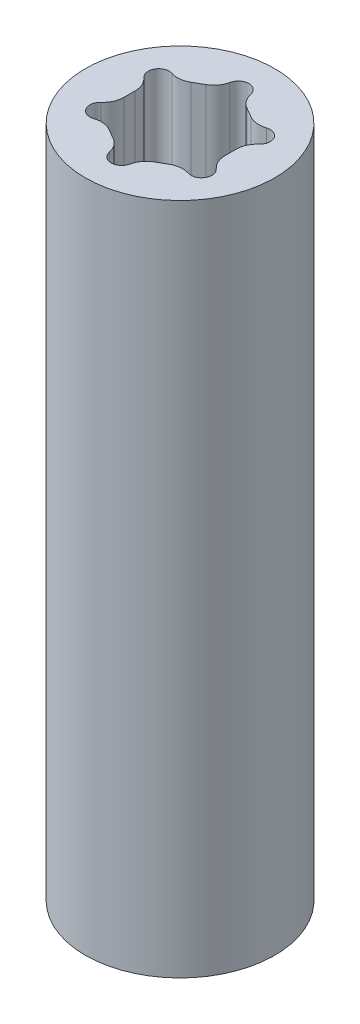
ISO-10303-21;
HEADER;
FILE_DESCRIPTION(('STEP AP214'),'2;1');
FILE_NAME('part.step','',(''),(''),'','','');
FILE_SCHEMA(('AUTOMOTIVE_DESIGN { 1 0 10303 214 1 1 1 1 }'));
ENDSEC;
DATA;
#1=APPLICATION_CONTEXT('core data for automotive mechanical design processes');
#2=APPLICATION_PROTOCOL_DEFINITION('international standard','automotive_design',2000,#1);
#3=PRODUCT_CONTEXT('',#1,'mechanical');
#4=PRODUCT('Part','Part','',(#3));
#5=PRODUCT_RELATED_PRODUCT_CATEGORY('part','',(#4));
#6=PRODUCT_DEFINITION_FORMATION('','',#4);
#7=PRODUCT_DEFINITION_CONTEXT('part definition',#1,'design');
#8=PRODUCT_DEFINITION('design','',#6,#7);
#9=PRODUCT_DEFINITION_SHAPE('','',#8);
#10=(LENGTH_UNIT() NAMED_UNIT(*) SI_UNIT(.MILLI.,.METRE.));
#11=(NAMED_UNIT(*) PLANE_ANGLE_UNIT() SI_UNIT($,.RADIAN.));
#12=(NAMED_UNIT(*) SI_UNIT($,.STERADIAN.) SOLID_ANGLE_UNIT());
#13=UNCERTAINTY_MEASURE_WITH_UNIT(LENGTH_MEASURE(1.E-05),#10,'distance_accuracy_value','');
#14=(GEOMETRIC_REPRESENTATION_CONTEXT(3) GLOBAL_UNCERTAINTY_ASSIGNED_CONTEXT((#13)) GLOBAL_UNIT_ASSIGNED_CONTEXT((#10,
#11,#12)) REPRESENTATION_CONTEXT('',''));
#15=CARTESIAN_POINT('',(0.,0.,0.));
#16=DIRECTION('',(0.,0.,1.));
#17=DIRECTION('',(1.,0.,0.));
#18=AXIS2_PLACEMENT_3D('',#15,#16,#17);
#19=CARTESIAN_POINT('',(0.,0.,0.));
#20=DIRECTION('',(0.,1.,0.));
#21=DIRECTION('',(0.,0.,1.));
#22=AXIS2_PLACEMENT_3D('',#19,#20,#21);
#23=PLANE('',#22);
#24=CARTESIAN_POINT('',(0.,0.,0.));
#25=DIRECTION('',(0.,1.,0.));
#26=DIRECTION('',(0.,0.,1.));
#27=AXIS2_PLACEMENT_3D('',#24,#25,#26);
#28=CIRCLE('',#27,4.5);
#29=CARTESIAN_POINT('',(0.,0.,4.5));
#30=VERTEX_POINT('',#29);
#31=EDGE_CURVE('E210',#30,#30,#28,.T.);
#32=ORIENTED_EDGE('',*,*,#31,.F.);
#33=EDGE_LOOP('',(#32));
#34=FACE_BOUND('',#33,.T.);
#35=CARTESIAN_POINT('',(0.,0.,0.));
#36=DIRECTION('',(0.,-1.,0.));
#37=DIRECTION('',(0.,0.,-1.));
#38=AXIS2_PLACEMENT_3D('',#35,#36,#37);
#39=CIRCLE('',#38,1.825);
#40=CARTESIAN_POINT('',(0.,0.,-1.825));
#41=VERTEX_POINT('',#40);
#42=EDGE_CURVE('E411',#41,#41,#39,.T.);
#43=ORIENTED_EDGE('',*,*,#42,.F.);
#44=EDGE_LOOP('',(#43));
#45=FACE_BOUND('',#44,.T.);
#46=ADVANCED_FACE('F39',(#34,#45),#23,.F.);
#47=CARTESIAN_POINT('',(-2.4,32.,-1.3856406460551));
#48=DIRECTION('',(0.,-1.,0.));
#49=DIRECTION('',(0.,0.,-1.));
#50=AXIS2_PLACEMENT_3D('',#47,#48,#49);
#51=CYLINDRICAL_SURFACE('',#50,0.5);
#52=CARTESIAN_POINT('',(-2.4,32.,-1.3856406460551));
#53=DIRECTION('',(0.,1.,0.));
#54=DIRECTION('',(0.,0.,1.));
#55=AXIS2_PLACEMENT_3D('',#52,#53,#54);
#56=CIRCLE('',#55,0.5);
#57=CARTESIAN_POINT('',(-2.24391805448272,32.,-1.8606547787749));
#58=VERTEX_POINT('',#57);
#59=CARTESIAN_POINT('',(-2.73333333333333,32.,-1.01296264980513));
#60=VERTEX_POINT('',#59);
#61=EDGE_CURVE('E376',#58,#60,#56,.T.);
#62=ORIENTED_EDGE('',*,*,#61,.T.);
#63=DIRECTION('',(0.,-1.,0.));
#64=VECTOR('',#63,1.);
#65=CARTESIAN_POINT('',(-2.73333333333333,32.,-1.01296264980513));
#66=LINE('',#65,#64);
#67=CARTESIAN_POINT('',(-2.73333333333333,9.,-1.01296264980513));
#68=VERTEX_POINT('',#67);
#69=EDGE_CURVE('E209',#60,#68,#66,.T.);
#70=ORIENTED_EDGE('',*,*,#69,.T.);
#71=CARTESIAN_POINT('',(-2.4,9.,-1.3856406460551));
#72=DIRECTION('',(0.,1.,0.));
#73=DIRECTION('',(0.,0.,1.));
#74=AXIS2_PLACEMENT_3D('',#71,#72,#73);
#75=CIRCLE('',#74,0.5);
#76=CARTESIAN_POINT('',(-2.24391805448272,9.,-1.8606547787749));
#77=VERTEX_POINT('',#76);
#78=EDGE_CURVE('E200',#77,#68,#75,.T.);
#79=ORIENTED_EDGE('',*,*,#78,.F.);
#80=DIRECTION('',(0.,-1.,0.));
#81=VECTOR('',#80,1.);
#82=CARTESIAN_POINT('',(-2.24391805448272,32.,-1.8606547787749));
#83=LINE('',#82,#81);
#84=EDGE_CURVE('E206',#77,#58,#83,.F.);
#85=ORIENTED_EDGE('',*,*,#84,.T.);
#86=EDGE_LOOP('',(#62,#70,#79,#85));
#87=FACE_BOUND('',#86,.T.);
#88=ADVANCED_FACE('F205',(#87),#51,.F.);
#89=CARTESIAN_POINT('',(-1.2,32.,-2.07846096908265));
#90=DIRECTION('',(0.5,0.,0.866025403784439));
#91=DIRECTION('',(0.866025403784439,0.,-0.5));
#92=AXIS2_PLACEMENT_3D('',#89,#90,#91);
#93=PLANE('',#92);
#94=DIRECTION('',(-0.866025403784439,0.,0.5));
#95=VECTOR('',#94,1.);
#96=CARTESIAN_POINT('',(-1.2,9.,-2.07846096908265));
#97=LINE('',#96,#95);
#98=CARTESIAN_POINT('',(-0.968245836551854,9.,-2.21226429773526));
#99=VERTEX_POINT('',#98);
#100=CARTESIAN_POINT('',(-1.43175416344815,9.,-1.94465764043005));
#101=VERTEX_POINT('',#100);
#102=EDGE_CURVE('E201',#99,#101,#97,.T.);
#103=ORIENTED_EDGE('',*,*,#102,.F.);
#104=DIRECTION('',(0.,-1.,0.));
#105=VECTOR('',#104,1.);
#106=CARTESIAN_POINT('',(-0.968245836551854,32.,-2.21226429773526));
#107=LINE('',#106,#105);
#108=CARTESIAN_POINT('',(-0.968245836551854,32.,-2.21226429773526));
#109=VERTEX_POINT('',#108);
#110=EDGE_CURVE('E300',#99,#109,#107,.F.);
#111=ORIENTED_EDGE('',*,*,#110,.T.);
#112=DIRECTION('',(-0.866025403784439,0.,0.5));
#113=VECTOR('',#112,1.);
#114=CARTESIAN_POINT('',(-1.2,32.,-2.07846096908265));
#115=LINE('',#114,#113);
#116=CARTESIAN_POINT('',(-1.43175416344815,32.,-1.94465764043005));
#117=VERTEX_POINT('',#116);
#118=EDGE_CURVE('E353',#109,#117,#115,.T.);
#119=ORIENTED_EDGE('',*,*,#118,.T.);
#120=DIRECTION('',(0.,-1.,0.));
#121=VECTOR('',#120,1.);
#122=CARTESIAN_POINT('',(-1.43175416344815,32.,-1.94465764043005));
#123=LINE('',#122,#121);
#124=EDGE_CURVE('E298',#117,#101,#123,.T.);
#125=ORIENTED_EDGE('',*,*,#124,.T.);
#126=EDGE_LOOP('',(#103,#111,#119,#125));
#127=FACE_BOUND('',#126,.T.);
#128=ADVANCED_FACE('F423',(#127),#93,.T.);
#129=CARTESIAN_POINT('',(0.,32.,-2.7712812921102));
#130=DIRECTION('',(0.,-1.,0.));
#131=DIRECTION('',(0.,0.,-1.));
#132=AXIS2_PLACEMENT_3D('',#129,#130,#131);
#133=CYLINDRICAL_SURFACE('',#132,0.5);
#134=CARTESIAN_POINT('',(0.,9.,-2.7712812921102));
#135=DIRECTION('',(0.,1.,0.));
#136=DIRECTION('',(0.,0.,1.));
#137=AXIS2_PLACEMENT_3D('',#134,#135,#136);
#138=CIRCLE('',#137,0.5);
#139=CARTESIAN_POINT('',(0.489415278850618,9.,-2.87361742858003));
#140=VERTEX_POINT('',#139);
#141=CARTESIAN_POINT('',(-0.489415278850618,9.,-2.87361742858003));
#142=VERTEX_POINT('',#141);
#143=EDGE_CURVE('E322',#140,#142,#138,.T.);
#144=ORIENTED_EDGE('',*,*,#143,.F.);
#145=DIRECTION('',(0.,-1.,0.));
#146=VECTOR('',#145,1.);
#147=CARTESIAN_POINT('',(0.489415278850618,32.,-2.87361742858003));
#148=LINE('',#147,#146);
#149=CARTESIAN_POINT('',(0.489415278850618,32.,-2.87361742858003));
#150=VERTEX_POINT('',#149);
#151=EDGE_CURVE('E296',#140,#150,#148,.F.);
#152=ORIENTED_EDGE('',*,*,#151,.T.);
#153=CARTESIAN_POINT('',(0.,32.,-2.7712812921102));
#154=DIRECTION('',(0.,1.,0.));
#155=DIRECTION('',(0.,0.,1.));
#156=AXIS2_PLACEMENT_3D('',#153,#154,#155);
#157=CIRCLE('',#156,0.5);
#158=CARTESIAN_POINT('',(-0.489415278850618,32.,-2.87361742858003));
#159=VERTEX_POINT('',#158);
#160=EDGE_CURVE('E344',#150,#159,#157,.T.);
#161=ORIENTED_EDGE('',*,*,#160,.T.);
#162=DIRECTION('',(0.,-1.,0.));
#163=VECTOR('',#162,1.);
#164=CARTESIAN_POINT('',(-0.489415278850618,32.,-2.87361742858003));
#165=LINE('',#164,#163);
#166=EDGE_CURVE('E293',#159,#142,#165,.T.);
#167=ORIENTED_EDGE('',*,*,#166,.T.);
#168=EDGE_LOOP('',(#144,#152,#161,#167));
#169=FACE_BOUND('',#168,.T.);
#170=ADVANCED_FACE('F329',(#169),#133,.F.);
#171=CARTESIAN_POINT('',(1.2,32.,-2.07846096908265));
#172=DIRECTION('',(-0.5,0.,0.866025403784439));
#173=DIRECTION('',(0.866025403784439,0.,0.5));
#174=AXIS2_PLACEMENT_3D('',#171,#172,#173);
#175=PLANE('',#174);
#176=DIRECTION('',(-0.866025403784439,0.,-0.5));
#177=VECTOR('',#176,1.);
#178=CARTESIAN_POINT('',(1.2,9.,-2.07846096908265));
#179=LINE('',#178,#177);
#180=CARTESIAN_POINT('',(1.43175416344814,9.,-1.94465764043005));
#181=VERTEX_POINT('',#180);
#182=CARTESIAN_POINT('',(0.968245836551854,9.,-2.21226429773526));
#183=VERTEX_POINT('',#182);
#184=EDGE_CURVE('E324',#181,#183,#179,.T.);
#185=ORIENTED_EDGE('',*,*,#184,.F.);
#186=DIRECTION('',(0.,-1.,0.));
#187=VECTOR('',#186,1.);
#188=CARTESIAN_POINT('',(1.43175416344814,32.,-1.94465764043005));
#189=LINE('',#188,#187);
#190=CARTESIAN_POINT('',(1.43175416344814,32.,-1.94465764043005));
#191=VERTEX_POINT('',#190);
#192=EDGE_CURVE('E291',#181,#191,#189,.F.);
#193=ORIENTED_EDGE('',*,*,#192,.T.);
#194=DIRECTION('',(-0.866025403784439,0.,-0.5));
#195=VECTOR('',#194,1.);
#196=CARTESIAN_POINT('',(1.2,32.,-2.07846096908265));
#197=LINE('',#196,#195);
#198=CARTESIAN_POINT('',(0.968245836551854,32.,-2.21226429773526));
#199=VERTEX_POINT('',#198);
#200=EDGE_CURVE('E342',#191,#199,#197,.T.);
#201=ORIENTED_EDGE('',*,*,#200,.T.);
#202=DIRECTION('',(0.,-1.,0.));
#203=VECTOR('',#202,1.);
#204=CARTESIAN_POINT('',(0.968245836551854,32.,-2.21226429773526));
#205=LINE('',#204,#203);
#206=EDGE_CURVE('E288',#199,#183,#205,.T.);
#207=ORIENTED_EDGE('',*,*,#206,.T.);
#208=EDGE_LOOP('',(#185,#193,#201,#207));
#209=FACE_BOUND('',#208,.T.);
#210=ADVANCED_FACE('F346',(#209),#175,.T.);
#211=CARTESIAN_POINT('',(2.4,32.,-1.3856406460551));
#212=DIRECTION('',(0.,-1.,0.));
#213=DIRECTION('',(0.,0.,-1.));
#214=AXIS2_PLACEMENT_3D('',#211,#212,#213);
#215=CYLINDRICAL_SURFACE('',#214,0.5);
#216=CARTESIAN_POINT('',(2.4,9.,-1.3856406460551));
#217=DIRECTION('',(0.,1.,0.));
#218=DIRECTION('',(0.,0.,1.));
#219=AXIS2_PLACEMENT_3D('',#216,#217,#218);
#220=CIRCLE('',#219,0.5);
#221=CARTESIAN_POINT('',(2.73333333333333,9.,-1.01296264980514));
#222=VERTEX_POINT('',#221);
#223=CARTESIAN_POINT('',(2.24391805448272,9.,-1.8606547787749));
#224=VERTEX_POINT('',#223);
#225=EDGE_CURVE('E384',#222,#224,#220,.T.);
#226=ORIENTED_EDGE('',*,*,#225,.F.);
#227=DIRECTION('',(0.,-1.,0.));
#228=VECTOR('',#227,1.);
#229=CARTESIAN_POINT('',(2.73333333333333,32.,-1.01296264980514));
#230=LINE('',#229,#228);
#231=CARTESIAN_POINT('',(2.73333333333333,32.,-1.01296264980514));
#232=VERTEX_POINT('',#231);
#233=EDGE_CURVE('E286',#222,#232,#230,.F.);
#234=ORIENTED_EDGE('',*,*,#233,.T.);
#235=CARTESIAN_POINT('',(2.4,32.,-1.3856406460551));
#236=DIRECTION('',(0.,1.,0.));
#237=DIRECTION('',(0.,0.,1.));
#238=AXIS2_PLACEMENT_3D('',#235,#236,#237);
#239=CIRCLE('',#238,0.5);
#240=CARTESIAN_POINT('',(2.24391805448272,32.,-1.8606547787749));
#241=VERTEX_POINT('',#240);
#242=EDGE_CURVE('E348',#232,#241,#239,.T.);
#243=ORIENTED_EDGE('',*,*,#242,.T.);
#244=DIRECTION('',(0.,-1.,0.));
#245=VECTOR('',#244,1.);
#246=CARTESIAN_POINT('',(2.24391805448272,32.,-1.8606547787749));
#247=LINE('',#246,#245);
#248=EDGE_CURVE('E283',#241,#224,#247,.T.);
#249=ORIENTED_EDGE('',*,*,#248,.T.);
#250=EDGE_LOOP('',(#226,#234,#243,#249));
#251=FACE_BOUND('',#250,.T.);
#252=ADVANCED_FACE('F459',(#251),#215,.F.);
#253=CARTESIAN_POINT('',(2.4,32.,0.));
#254=DIRECTION('',(-1.,0.,0.));
#255=DIRECTION('',(0.,0.,1.));
#256=AXIS2_PLACEMENT_3D('',#253,#254,#255);
#257=PLANE('',#256);
#258=DIRECTION('',(0.,0.,-1.));
#259=VECTOR('',#258,1.);
#260=CARTESIAN_POINT('',(2.4,9.,0.));
#261=LINE('',#260,#259);
#262=CARTESIAN_POINT('',(2.4,9.,0.267606657305206));
#263=VERTEX_POINT('',#262);
#264=CARTESIAN_POINT('',(2.4,9.,-0.267606657305207));
#265=VERTEX_POINT('',#264);
#266=EDGE_CURVE('E387',#263,#265,#261,.T.);
#267=ORIENTED_EDGE('',*,*,#266,.F.);
#268=DIRECTION('',(0.,-1.,0.));
#269=VECTOR('',#268,1.);
#270=CARTESIAN_POINT('',(2.4,32.,0.267606657305206));
#271=LINE('',#270,#269);
#272=CARTESIAN_POINT('',(2.4,32.,0.267606657305206));
#273=VERTEX_POINT('',#272);
#274=EDGE_CURVE('E281',#263,#273,#271,.F.);
#275=ORIENTED_EDGE('',*,*,#274,.T.);
#276=DIRECTION('',(0.,0.,-1.));
#277=VECTOR('',#276,1.);
#278=CARTESIAN_POINT('',(2.4,32.,0.));
#279=LINE('',#278,#277);
#280=CARTESIAN_POINT('',(2.4,32.,-0.267606657305207));
#281=VERTEX_POINT('',#280);
#282=EDGE_CURVE('E351',#273,#281,#279,.T.);
#283=ORIENTED_EDGE('',*,*,#282,.T.);
#284=DIRECTION('',(0.,-1.,0.));
#285=VECTOR('',#284,1.);
#286=CARTESIAN_POINT('',(2.4,32.,-0.267606657305207));
#287=LINE('',#286,#285);
#288=EDGE_CURVE('E278',#281,#265,#287,.T.);
#289=ORIENTED_EDGE('',*,*,#288,.T.);
#290=EDGE_LOOP('',(#267,#275,#283,#289));
#291=FACE_BOUND('',#290,.T.);
#292=ADVANCED_FACE('F455',(#291),#257,.T.);
#293=CARTESIAN_POINT('',(2.4,32.,1.3856406460551));
#294=DIRECTION('',(0.,-1.,0.));
#295=DIRECTION('',(0.,0.,-1.));
#296=AXIS2_PLACEMENT_3D('',#293,#294,#295);
#297=CYLINDRICAL_SURFACE('',#296,0.5);
#298=CARTESIAN_POINT('',(2.4,9.,1.3856406460551));
#299=DIRECTION('',(0.,1.,0.));
#300=DIRECTION('',(0.,0.,1.));
#301=AXIS2_PLACEMENT_3D('',#298,#299,#300);
#302=CIRCLE('',#301,0.5);
#303=CARTESIAN_POINT('',(2.24391805448272,9.,1.8606547787749));
#304=VERTEX_POINT('',#303);
#305=CARTESIAN_POINT('',(2.73333333333333,9.,1.01296264980514));
#306=VERTEX_POINT('',#305);
#307=EDGE_CURVE('E390',#304,#306,#302,.T.);
#308=ORIENTED_EDGE('',*,*,#307,.F.);
#309=DIRECTION('',(0.,-1.,0.));
#310=VECTOR('',#309,1.);
#311=CARTESIAN_POINT('',(2.24391805448272,32.,1.8606547787749));
#312=LINE('',#311,#310);
#313=CARTESIAN_POINT('',(2.24391805448272,32.,1.8606547787749));
#314=VERTEX_POINT('',#313);
#315=EDGE_CURVE('E276',#304,#314,#312,.F.);
#316=ORIENTED_EDGE('',*,*,#315,.T.);
#317=CARTESIAN_POINT('',(2.4,32.,1.3856406460551));
#318=DIRECTION('',(0.,1.,0.));
#319=DIRECTION('',(0.,0.,1.));
#320=AXIS2_PLACEMENT_3D('',#317,#318,#319);
#321=CIRCLE('',#320,0.5);
#322=CARTESIAN_POINT('',(2.73333333333333,32.,1.01296264980514));
#323=VERTEX_POINT('',#322);
#324=EDGE_CURVE('E359',#314,#323,#321,.T.);
#325=ORIENTED_EDGE('',*,*,#324,.T.);
#326=DIRECTION('',(0.,-1.,0.));
#327=VECTOR('',#326,1.);
#328=CARTESIAN_POINT('',(2.73333333333333,32.,1.01296264980514));
#329=LINE('',#328,#327);
#330=EDGE_CURVE('E273',#323,#306,#329,.T.);
#331=ORIENTED_EDGE('',*,*,#330,.T.);
#332=EDGE_LOOP('',(#308,#316,#325,#331));
#333=FACE_BOUND('',#332,.T.);
#334=ADVANCED_FACE('F451',(#333),#297,.F.);
#335=CARTESIAN_POINT('',(1.2,32.,2.07846096908265));
#336=DIRECTION('',(-0.5,0.,-0.866025403784438));
#337=DIRECTION('',(-0.866025403784438,0.,0.5));
#338=AXIS2_PLACEMENT_3D('',#335,#336,#337);
#339=PLANE('',#338);
#340=DIRECTION('',(0.866025403784438,0.,-0.5));
#341=VECTOR('',#340,1.);
#342=CARTESIAN_POINT('',(1.2,32.,2.07846096908265));
#343=LINE('',#342,#341);
#344=CARTESIAN_POINT('',(0.968245836551854,32.,2.21226429773526));
#345=VERTEX_POINT('',#344);
#346=CARTESIAN_POINT('',(1.43175416344815,32.,1.94465764043005));
#347=VERTEX_POINT('',#346);
#348=EDGE_CURVE('E362',#345,#347,#343,.T.);
#349=ORIENTED_EDGE('',*,*,#348,.T.);
#350=DIRECTION('',(0.,-1.,0.));
#351=VECTOR('',#350,1.);
#352=CARTESIAN_POINT('',(1.43175416344815,32.,1.94465764043005));
#353=LINE('',#352,#351);
#354=CARTESIAN_POINT('',(1.43175416344815,9.,1.94465764043005));
#355=VERTEX_POINT('',#354);
#356=EDGE_CURVE('E270',#347,#355,#353,.T.);
#357=ORIENTED_EDGE('',*,*,#356,.T.);
#358=DIRECTION('',(0.866025403784438,0.,-0.5));
#359=VECTOR('',#358,1.);
#360=CARTESIAN_POINT('',(1.2,9.,2.07846096908265));
#361=LINE('',#360,#359);
#362=CARTESIAN_POINT('',(0.968245836551854,9.,2.21226429773526));
#363=VERTEX_POINT('',#362);
#364=EDGE_CURVE('E393',#363,#355,#361,.T.);
#365=ORIENTED_EDGE('',*,*,#364,.F.);
#366=DIRECTION('',(0.,-1.,0.));
#367=VECTOR('',#366,1.);
#368=CARTESIAN_POINT('',(0.968245836551854,32.,2.21226429773526));
#369=LINE('',#368,#367);
#370=EDGE_CURVE('E268',#363,#345,#369,.F.);
#371=ORIENTED_EDGE('',*,*,#370,.T.);
#372=EDGE_LOOP('',(#349,#357,#365,#371));
#373=FACE_BOUND('',#372,.T.);
#374=ADVANCED_FACE('F447',(#373),#339,.T.);
#375=CARTESIAN_POINT('',(0.,32.,2.7712812921102));
#376=DIRECTION('',(0.,-1.,0.));
#377=DIRECTION('',(0.,0.,-1.));
#378=AXIS2_PLACEMENT_3D('',#375,#376,#377);
#379=CYLINDRICAL_SURFACE('',#378,0.5);
#380=CARTESIAN_POINT('',(0.,9.,2.7712812921102));
#381=DIRECTION('',(0.,1.,0.));
#382=DIRECTION('',(0.,0.,1.));
#383=AXIS2_PLACEMENT_3D('',#380,#381,#382);
#384=CIRCLE('',#383,0.5);
#385=CARTESIAN_POINT('',(-0.489415278850618,9.,2.87361742858003));
#386=VERTEX_POINT('',#385);
#387=CARTESIAN_POINT('',(0.489415278850618,9.,2.87361742858003));
#388=VERTEX_POINT('',#387);
#389=EDGE_CURVE('E396',#386,#388,#384,.T.);
#390=ORIENTED_EDGE('',*,*,#389,.F.);
#391=DIRECTION('',(0.,-1.,0.));
#392=VECTOR('',#391,1.);
#393=CARTESIAN_POINT('',(-0.489415278850618,32.,2.87361742858003));
#394=LINE('',#393,#392);
#395=CARTESIAN_POINT('',(-0.489415278850618,32.,2.87361742858003));
#396=VERTEX_POINT('',#395);
#397=EDGE_CURVE('E266',#386,#396,#394,.F.);
#398=ORIENTED_EDGE('',*,*,#397,.T.);
#399=CARTESIAN_POINT('',(0.,32.,2.7712812921102));
#400=DIRECTION('',(0.,1.,0.));
#401=DIRECTION('',(0.,0.,1.));
#402=AXIS2_PLACEMENT_3D('',#399,#400,#401);
#403=CIRCLE('',#402,0.5);
#404=CARTESIAN_POINT('',(0.489415278850618,32.,2.87361742858003));
#405=VERTEX_POINT('',#404);
#406=EDGE_CURVE('E365',#396,#405,#403,.T.);
#407=ORIENTED_EDGE('',*,*,#406,.T.);
#408=DIRECTION('',(0.,-1.,0.));
#409=VECTOR('',#408,1.);
#410=CARTESIAN_POINT('',(0.489415278850618,32.,2.87361742858003));
#411=LINE('',#410,#409);
#412=EDGE_CURVE('E263',#405,#388,#411,.T.);
#413=ORIENTED_EDGE('',*,*,#412,.T.);
#414=EDGE_LOOP('',(#390,#398,#407,#413));
#415=FACE_BOUND('',#414,.T.);
#416=ADVANCED_FACE('F443',(#415),#379,.F.);
#417=CARTESIAN_POINT('',(-1.2,32.,2.07846096908265));
#418=DIRECTION('',(0.5,0.,-0.866025403784439));
#419=DIRECTION('',(-0.866025403784439,0.,-0.5));
#420=AXIS2_PLACEMENT_3D('',#417,#418,#419);
#421=PLANE('',#420);
#422=DIRECTION('',(0.866025403784439,0.,0.5));
#423=VECTOR('',#422,1.);
#424=CARTESIAN_POINT('',(-1.2,9.,2.07846096908265));
#425=LINE('',#424,#423);
#426=CARTESIAN_POINT('',(-1.43175416344814,9.,1.94465764043005));
#427=VERTEX_POINT('',#426);
#428=CARTESIAN_POINT('',(-0.968245836551854,9.,2.21226429773526));
#429=VERTEX_POINT('',#428);
#430=EDGE_CURVE('E399',#427,#429,#425,.T.);
#431=ORIENTED_EDGE('',*,*,#430,.F.);
#432=DIRECTION('',(0.,-1.,0.));
#433=VECTOR('',#432,1.);
#434=CARTESIAN_POINT('',(-1.43175416344814,32.,1.94465764043005));
#435=LINE('',#434,#433);
#436=CARTESIAN_POINT('',(-1.43175416344814,32.,1.94465764043005));
#437=VERTEX_POINT('',#436);
#438=EDGE_CURVE('E261',#427,#437,#435,.F.);
#439=ORIENTED_EDGE('',*,*,#438,.T.);
#440=DIRECTION('',(0.866025403784439,0.,0.5));
#441=VECTOR('',#440,1.);
#442=CARTESIAN_POINT('',(-1.2,32.,2.07846096908265));
#443=LINE('',#442,#441);
#444=CARTESIAN_POINT('',(-0.968245836551854,32.,2.21226429773526));
#445=VERTEX_POINT('',#444);
#446=EDGE_CURVE('E368',#437,#445,#443,.T.);
#447=ORIENTED_EDGE('',*,*,#446,.T.);
#448=DIRECTION('',(0.,-1.,0.));
#449=VECTOR('',#448,1.);
#450=CARTESIAN_POINT('',(-0.968245836551854,32.,2.21226429773526));
#451=LINE('',#450,#449);
#452=EDGE_CURVE('E258',#445,#429,#451,.T.);
#453=ORIENTED_EDGE('',*,*,#452,.T.);
#454=EDGE_LOOP('',(#431,#439,#447,#453));
#455=FACE_BOUND('',#454,.T.);
#456=ADVANCED_FACE('F439',(#455),#421,.T.);
#457=CARTESIAN_POINT('',(-2.4,32.,1.3856406460551));
#458=DIRECTION('',(0.,-1.,0.));
#459=DIRECTION('',(0.,0.,-1.));
#460=AXIS2_PLACEMENT_3D('',#457,#458,#459);
#461=CYLINDRICAL_SURFACE('',#460,0.5);
#462=CARTESIAN_POINT('',(-2.4,9.,1.3856406460551));
#463=DIRECTION('',(0.,1.,0.));
#464=DIRECTION('',(0.,0.,1.));
#465=AXIS2_PLACEMENT_3D('',#462,#463,#464);
#466=CIRCLE('',#465,0.5);
#467=CARTESIAN_POINT('',(-2.73333333333333,9.,1.01296264980514));
#468=VERTEX_POINT('',#467);
#469=CARTESIAN_POINT('',(-2.24391805448271,9.,1.8606547787749));
#470=VERTEX_POINT('',#469);
#471=EDGE_CURVE('E402',#468,#470,#466,.T.);
#472=ORIENTED_EDGE('',*,*,#471,.F.);
#473=DIRECTION('',(0.,-1.,0.));
#474=VECTOR('',#473,1.);
#475=CARTESIAN_POINT('',(-2.73333333333333,32.,1.01296264980514));
#476=LINE('',#475,#474);
#477=CARTESIAN_POINT('',(-2.73333333333333,32.,1.01296264980514));
#478=VERTEX_POINT('',#477);
#479=EDGE_CURVE('E256',#468,#478,#476,.F.);
#480=ORIENTED_EDGE('',*,*,#479,.T.);
#481=CARTESIAN_POINT('',(-2.4,32.,1.3856406460551));
#482=DIRECTION('',(0.,1.,0.));
#483=DIRECTION('',(0.,0.,1.));
#484=AXIS2_PLACEMENT_3D('',#481,#482,#483);
#485=CIRCLE('',#484,0.5);
#486=CARTESIAN_POINT('',(-2.24391805448271,32.,1.8606547787749));
#487=VERTEX_POINT('',#486);
#488=EDGE_CURVE('E371',#478,#487,#485,.T.);
#489=ORIENTED_EDGE('',*,*,#488,.T.);
#490=DIRECTION('',(0.,-1.,0.));
#491=VECTOR('',#490,1.);
#492=CARTESIAN_POINT('',(-2.24391805448271,32.,1.8606547787749));
#493=LINE('',#492,#491);
#494=EDGE_CURVE('E253',#487,#470,#493,.T.);
#495=ORIENTED_EDGE('',*,*,#494,.T.);
#496=EDGE_LOOP('',(#472,#480,#489,#495));
#497=FACE_BOUND('',#496,.T.);
#498=ADVANCED_FACE('F435',(#497),#461,.F.);
#499=CARTESIAN_POINT('',(-2.4,32.,0.));
#500=DIRECTION('',(1.,0.,0.));
#501=DIRECTION('',(0.,0.,-1.));
#502=AXIS2_PLACEMENT_3D('',#499,#500,#501);
#503=PLANE('',#502);
#504=DIRECTION('',(0.,0.,1.));
#505=VECTOR('',#504,1.);
#506=CARTESIAN_POINT('',(-2.4,9.,0.));
#507=LINE('',#506,#505);
#508=CARTESIAN_POINT('',(-2.4,9.,-0.267606657305204));
#509=VERTEX_POINT('',#508);
#510=CARTESIAN_POINT('',(-2.4,9.,0.267606657305208));
#511=VERTEX_POINT('',#510);
#512=EDGE_CURVE('E405',#509,#511,#507,.T.);
#513=ORIENTED_EDGE('',*,*,#512,.F.);
#514=DIRECTION('',(0.,-1.,0.));
#515=VECTOR('',#514,1.);
#516=CARTESIAN_POINT('',(-2.4,32.,-0.267606657305204));
#517=LINE('',#516,#515);
#518=CARTESIAN_POINT('',(-2.4,32.,-0.267606657305204));
#519=VERTEX_POINT('',#518);
#520=EDGE_CURVE('E228',#509,#519,#517,.F.);
#521=ORIENTED_EDGE('',*,*,#520,.T.);
#522=DIRECTION('',(0.,0.,1.));
#523=VECTOR('',#522,1.);
#524=CARTESIAN_POINT('',(-2.4,32.,0.));
#525=LINE('',#524,#523);
#526=CARTESIAN_POINT('',(-2.4,32.,0.267606657305208));
#527=VERTEX_POINT('',#526);
#528=EDGE_CURVE('E220',#519,#527,#525,.T.);
#529=ORIENTED_EDGE('',*,*,#528,.T.);
#530=DIRECTION('',(0.,-1.,0.));
#531=VECTOR('',#530,1.);
#532=CARTESIAN_POINT('',(-2.4,32.,0.267606657305208));
#533=LINE('',#532,#531);
#534=EDGE_CURVE('E217',#527,#511,#533,.T.);
#535=ORIENTED_EDGE('',*,*,#534,.T.);
#536=EDGE_LOOP('',(#513,#521,#529,#535));
#537=FACE_BOUND('',#536,.T.);
#538=ADVANCED_FACE('F431',(#537),#503,.T.);
#539=CARTESIAN_POINT('',(0.,32.,0.));
#540=DIRECTION('',(0.,-1.,0.));
#541=DIRECTION('',(0.,0.,-1.));
#542=AXIS2_PLACEMENT_3D('',#539,#540,#541);
#543=CYLINDRICAL_SURFACE('',#542,4.5);
#544=CARTESIAN_POINT('',(0.,32.,0.));
#545=DIRECTION('',(0.,1.,0.));
#546=DIRECTION('',(0.,0.,1.));
#547=AXIS2_PLACEMENT_3D('',#544,#545,#546);
#548=CIRCLE('',#547,4.5);
#549=CARTESIAN_POINT('',(0.,32.,4.5));
#550=VERTEX_POINT('',#549);
#551=EDGE_CURVE('E215',#550,#550,#548,.T.);
#552=ORIENTED_EDGE('',*,*,#551,.F.);
#553=EDGE_LOOP('',(#552));
#554=FACE_BOUND('',#553,.T.);
#555=ORIENTED_EDGE('',*,*,#31,.T.);
#556=EDGE_LOOP('',(#555));
#557=FACE_BOUND('',#556,.T.);
#558=ADVANCED_FACE('F428',(#554,#557),#543,.T.);
#559=CARTESIAN_POINT('',(0.,32.,0.));
#560=DIRECTION('',(0.,1.,0.));
#561=DIRECTION('',(0.,0.,1.));
#562=AXIS2_PLACEMENT_3D('',#559,#560,#561);
#563=PLANE('',#562);
#564=ORIENTED_EDGE('',*,*,#528,.F.);
#565=CARTESIAN_POINT('',(-3.4,32.,-0.267606657305204));
#566=DIRECTION('',(0.,1.,0.));
#567=DIRECTION('',(0.,0.,1.));
#568=AXIS2_PLACEMENT_3D('',#565,#566,#567);
#569=CIRCLE('',#568,1.);
#570=EDGE_CURVE('E251',#519,#60,#569,.T.);
#571=ORIENTED_EDGE('',*,*,#570,.T.);
#572=ORIENTED_EDGE('',*,*,#61,.F.);
#573=CARTESIAN_POINT('',(-1.93175416344815,32.,-2.81068304421449));
#574=DIRECTION('',(0.,1.,0.));
#575=DIRECTION('',(0.,0.,1.));
#576=AXIS2_PLACEMENT_3D('',#573,#574,#575);
#577=CIRCLE('',#576,1.);
#578=EDGE_CURVE('E214',#58,#117,#577,.T.);
#579=ORIENTED_EDGE('',*,*,#578,.T.);
#580=ORIENTED_EDGE('',*,*,#118,.F.);
#581=CARTESIAN_POINT('',(-1.46824583655185,32.,-3.0782897015197));
#582=DIRECTION('',(0.,1.,0.));
#583=DIRECTION('',(0.,0.,1.));
#584=AXIS2_PLACEMENT_3D('',#581,#582,#583);
#585=CIRCLE('',#584,1.);
#586=EDGE_CURVE('E233',#109,#159,#585,.T.);
#587=ORIENTED_EDGE('',*,*,#586,.T.);
#588=ORIENTED_EDGE('',*,*,#160,.F.);
#589=CARTESIAN_POINT('',(1.46824583655185,32.,-3.0782897015197));
#590=DIRECTION('',(0.,1.,0.));
#591=DIRECTION('',(0.,0.,1.));
#592=AXIS2_PLACEMENT_3D('',#589,#590,#591);
#593=CIRCLE('',#592,1.);
#594=EDGE_CURVE('E235',#150,#199,#593,.T.);
#595=ORIENTED_EDGE('',*,*,#594,.T.);
#596=ORIENTED_EDGE('',*,*,#200,.F.);
#597=CARTESIAN_POINT('',(1.93175416344814,32.,-2.81068304421449));
#598=DIRECTION('',(0.,1.,0.));
#599=DIRECTION('',(0.,0.,1.));
#600=AXIS2_PLACEMENT_3D('',#597,#598,#599);
#601=CIRCLE('',#600,1.);
#602=EDGE_CURVE('E237',#191,#241,#601,.T.);
#603=ORIENTED_EDGE('',*,*,#602,.T.);
#604=ORIENTED_EDGE('',*,*,#242,.F.);
#605=CARTESIAN_POINT('',(3.4,32.,-0.267606657305208));
#606=DIRECTION('',(0.,1.,0.));
#607=DIRECTION('',(0.,0.,1.));
#608=AXIS2_PLACEMENT_3D('',#605,#606,#607);
#609=CIRCLE('',#608,1.);
#610=EDGE_CURVE('E239',#232,#281,#609,.T.);
#611=ORIENTED_EDGE('',*,*,#610,.T.);
#612=ORIENTED_EDGE('',*,*,#282,.F.);
#613=CARTESIAN_POINT('',(3.4,32.,0.267606657305206));
#614=DIRECTION('',(0.,1.,0.));
#615=DIRECTION('',(0.,0.,1.));
#616=AXIS2_PLACEMENT_3D('',#613,#614,#615);
#617=CIRCLE('',#616,1.);
#618=EDGE_CURVE('E241',#273,#323,#617,.T.);
#619=ORIENTED_EDGE('',*,*,#618,.T.);
#620=ORIENTED_EDGE('',*,*,#324,.F.);
#621=CARTESIAN_POINT('',(1.93175416344815,32.,2.81068304421449));
#622=DIRECTION('',(0.,1.,0.));
#623=DIRECTION('',(0.,0.,1.));
#624=AXIS2_PLACEMENT_3D('',#621,#622,#623);
#625=CIRCLE('',#624,1.);
#626=EDGE_CURVE('E243',#314,#347,#625,.T.);
#627=ORIENTED_EDGE('',*,*,#626,.T.);
#628=ORIENTED_EDGE('',*,*,#348,.F.);
#629=CARTESIAN_POINT('',(1.46824583655185,32.,3.07828970151969));
#630=DIRECTION('',(0.,1.,0.));
#631=DIRECTION('',(0.,0.,1.));
#632=AXIS2_PLACEMENT_3D('',#629,#630,#631);
#633=CIRCLE('',#632,1.);
#634=EDGE_CURVE('E230',#345,#405,#633,.T.);
#635=ORIENTED_EDGE('',*,*,#634,.T.);
#636=ORIENTED_EDGE('',*,*,#406,.F.);
#637=CARTESIAN_POINT('',(-1.46824583655185,32.,3.0782897015197));
#638=DIRECTION('',(0.,1.,0.));
#639=DIRECTION('',(0.,0.,1.));
#640=AXIS2_PLACEMENT_3D('',#637,#638,#639);
#641=CIRCLE('',#640,1.);
#642=EDGE_CURVE('E245',#396,#445,#641,.T.);
#643=ORIENTED_EDGE('',*,*,#642,.T.);
#644=ORIENTED_EDGE('',*,*,#446,.F.);
#645=CARTESIAN_POINT('',(-1.93175416344814,32.,2.81068304421449));
#646=DIRECTION('',(0.,1.,0.));
#647=DIRECTION('',(0.,0.,1.));
#648=AXIS2_PLACEMENT_3D('',#645,#646,#647);
#649=CIRCLE('',#648,1.);
#650=EDGE_CURVE('E247',#437,#487,#649,.T.);
#651=ORIENTED_EDGE('',*,*,#650,.T.);
#652=ORIENTED_EDGE('',*,*,#488,.F.);
#653=CARTESIAN_POINT('',(-3.4,32.,0.267606657305208));
#654=DIRECTION('',(0.,1.,0.));
#655=DIRECTION('',(0.,0.,1.));
#656=AXIS2_PLACEMENT_3D('',#653,#654,#655);
#657=CIRCLE('',#656,1.);
#658=EDGE_CURVE('E249',#478,#527,#657,.T.);
#659=ORIENTED_EDGE('',*,*,#658,.T.);
#660=EDGE_LOOP('',(#564,#571,#572,#579,#580,#587,#588,#595,#596,#603,#604,#611,#612,#619,#620,
#627,#628,#635,#636,#643,#644,#651,#652,#659));
#661=FACE_BOUND('',#660,.T.);
#662=ORIENTED_EDGE('',*,*,#551,.T.);
#663=EDGE_LOOP('',(#662));
#664=FACE_BOUND('',#663,.T.);
#665=ADVANCED_FACE('F340',(#661,#664),#563,.T.);
#666=CARTESIAN_POINT('',(0.,9.,0.));
#667=DIRECTION('',(0.,1.,0.));
#668=DIRECTION('',(0.,0.,1.));
#669=AXIS2_PLACEMENT_3D('',#666,#667,#668);
#670=PLANE('',#669);
#671=CARTESIAN_POINT('',(0.,9.,0.));
#672=DIRECTION('',(0.,1.,0.));
#673=DIRECTION('',(0.,0.,1.));
#674=AXIS2_PLACEMENT_3D('',#671,#672,#673);
#675=CIRCLE('',#674,1.8);
#676=CARTESIAN_POINT('',(0.,9.,1.8));
#677=VERTEX_POINT('',#676);
#678=EDGE_CURVE('E223',#677,#677,#675,.T.);
#679=ORIENTED_EDGE('',*,*,#678,.F.);
#680=EDGE_LOOP('',(#679));
#681=FACE_BOUND('',#680,.T.);
#682=ORIENTED_EDGE('',*,*,#143,.T.);
#683=CARTESIAN_POINT('',(-1.46824583655185,9.,-3.0782897015197));
#684=DIRECTION('',(0.,1.,0.));
#685=DIRECTION('',(0.,0.,1.));
#686=AXIS2_PLACEMENT_3D('',#683,#684,#685);
#687=CIRCLE('',#686,1.);
#688=EDGE_CURVE('E61',#142,#99,#687,.F.);
#689=ORIENTED_EDGE('',*,*,#688,.T.);
#690=ORIENTED_EDGE('',*,*,#102,.T.);
#691=CARTESIAN_POINT('',(-1.93175416344815,9.,-2.81068304421449));
#692=DIRECTION('',(0.,1.,0.));
#693=DIRECTION('',(0.,0.,1.));
#694=AXIS2_PLACEMENT_3D('',#691,#692,#693);
#695=CIRCLE('',#694,1.);
#696=EDGE_CURVE('E47',#101,#77,#695,.F.);
#697=ORIENTED_EDGE('',*,*,#696,.T.);
#698=ORIENTED_EDGE('',*,*,#78,.T.);
#699=CARTESIAN_POINT('',(-3.4,9.,-0.267606657305204));
#700=DIRECTION('',(0.,1.,0.));
#701=DIRECTION('',(0.,0.,1.));
#702=AXIS2_PLACEMENT_3D('',#699,#700,#701);
#703=CIRCLE('',#702,1.);
#704=EDGE_CURVE('E302',#68,#509,#703,.F.);
#705=ORIENTED_EDGE('',*,*,#704,.T.);
#706=ORIENTED_EDGE('',*,*,#512,.T.);
#707=CARTESIAN_POINT('',(-3.4,9.,0.267606657305208));
#708=DIRECTION('',(0.,1.,0.));
#709=DIRECTION('',(0.,0.,1.));
#710=AXIS2_PLACEMENT_3D('',#707,#708,#709);
#711=CIRCLE('',#710,1.);
#712=EDGE_CURVE('E304',#511,#468,#711,.F.);
#713=ORIENTED_EDGE('',*,*,#712,.T.);
#714=ORIENTED_EDGE('',*,*,#471,.T.);
#715=CARTESIAN_POINT('',(-1.93175416344814,9.,2.81068304421449));
#716=DIRECTION('',(0.,1.,0.));
#717=DIRECTION('',(0.,0.,1.));
#718=AXIS2_PLACEMENT_3D('',#715,#716,#717);
#719=CIRCLE('',#718,1.);
#720=EDGE_CURVE('E306',#470,#427,#719,.F.);
#721=ORIENTED_EDGE('',*,*,#720,.T.);
#722=ORIENTED_EDGE('',*,*,#430,.T.);
#723=CARTESIAN_POINT('',(-1.46824583655185,9.,3.0782897015197));
#724=DIRECTION('',(0.,1.,0.));
#725=DIRECTION('',(0.,0.,1.));
#726=AXIS2_PLACEMENT_3D('',#723,#724,#725);
#727=CIRCLE('',#726,1.);
#728=EDGE_CURVE('E308',#429,#386,#727,.F.);
#729=ORIENTED_EDGE('',*,*,#728,.T.);
#730=ORIENTED_EDGE('',*,*,#389,.T.);
#731=CARTESIAN_POINT('',(1.46824583655185,9.,3.07828970151969));
#732=DIRECTION('',(0.,1.,0.));
#733=DIRECTION('',(0.,0.,1.));
#734=AXIS2_PLACEMENT_3D('',#731,#732,#733);
#735=CIRCLE('',#734,1.);
#736=EDGE_CURVE('E11',#388,#363,#735,.F.);
#737=ORIENTED_EDGE('',*,*,#736,.T.);
#738=ORIENTED_EDGE('',*,*,#364,.T.);
#739=CARTESIAN_POINT('',(1.93175416344815,9.,2.81068304421449));
#740=DIRECTION('',(0.,1.,0.));
#741=DIRECTION('',(0.,0.,1.));
#742=AXIS2_PLACEMENT_3D('',#739,#740,#741);
#743=CIRCLE('',#742,1.);
#744=EDGE_CURVE('E310',#355,#304,#743,.F.);
#745=ORIENTED_EDGE('',*,*,#744,.T.);
#746=ORIENTED_EDGE('',*,*,#307,.T.);
#747=CARTESIAN_POINT('',(3.4,9.,0.267606657305206));
#748=DIRECTION('',(0.,1.,0.));
#749=DIRECTION('',(0.,0.,1.));
#750=AXIS2_PLACEMENT_3D('',#747,#748,#749);
#751=CIRCLE('',#750,1.);
#752=EDGE_CURVE('E312',#306,#263,#751,.F.);
#753=ORIENTED_EDGE('',*,*,#752,.T.);
#754=ORIENTED_EDGE('',*,*,#266,.T.);
#755=CARTESIAN_POINT('',(3.4,9.,-0.267606657305208));
#756=DIRECTION('',(0.,1.,0.));
#757=DIRECTION('',(0.,0.,1.));
#758=AXIS2_PLACEMENT_3D('',#755,#756,#757);
#759=CIRCLE('',#758,1.);
#760=EDGE_CURVE('E314',#265,#222,#759,.F.);
#761=ORIENTED_EDGE('',*,*,#760,.T.);
#762=ORIENTED_EDGE('',*,*,#225,.T.);
#763=CARTESIAN_POINT('',(1.93175416344814,9.,-2.81068304421449));
#764=DIRECTION('',(0.,1.,0.));
#765=DIRECTION('',(0.,0.,1.));
#766=AXIS2_PLACEMENT_3D('',#763,#764,#765);
#767=CIRCLE('',#766,1.);
#768=EDGE_CURVE('E316',#224,#181,#767,.F.);
#769=ORIENTED_EDGE('',*,*,#768,.T.);
#770=ORIENTED_EDGE('',*,*,#184,.T.);
#771=CARTESIAN_POINT('',(1.46824583655185,9.,-3.0782897015197));
#772=DIRECTION('',(0.,1.,0.));
#773=DIRECTION('',(0.,0.,1.));
#774=AXIS2_PLACEMENT_3D('',#771,#772,#773);
#775=CIRCLE('',#774,1.);
#776=EDGE_CURVE('E318',#183,#140,#775,.F.);
#777=ORIENTED_EDGE('',*,*,#776,.T.);
#778=EDGE_LOOP('',(#682,#689,#690,#697,#698,#705,#706,#713,#714,#721,#722,#729,#730,#737,#738,
#745,#746,#753,#754,#761,#762,#769,#770,#777));
#779=FACE_BOUND('',#778,.T.);
#780=ADVANCED_FACE('F199',(#681,#779),#670,.T.);
#781=CARTESIAN_POINT('',(0.,0.,0.));
#782=DIRECTION('',(0.,-1.,0.));
#783=DIRECTION('',(0.,0.,-1.));
#784=AXIS2_PLACEMENT_3D('',#781,#782,#783);
#785=CYLINDRICAL_SURFACE('',#784,1.8);
#786=ORIENTED_EDGE('',*,*,#678,.T.);
#787=EDGE_LOOP('',(#786));
#788=FACE_BOUND('',#787,.T.);
#789=CARTESIAN_POINT('',(0.,0.0250000000000003,0.));
#790=DIRECTION('',(0.,-1.,0.));
#791=DIRECTION('',(0.,0.,-1.));
#792=AXIS2_PLACEMENT_3D('',#789,#790,#791);
#793=CIRCLE('',#792,1.8);
#794=CARTESIAN_POINT('',(0.,0.0250000000000003,-1.8));
#795=VERTEX_POINT('',#794);
#796=EDGE_CURVE('E408',#795,#795,#793,.T.);
#797=ORIENTED_EDGE('',*,*,#796,.T.);
#798=EDGE_LOOP('',(#797));
#799=FACE_BOUND('',#798,.T.);
#800=ADVANCED_FACE('F644',(#788,#799),#785,.F.);
#801=CARTESIAN_POINT('',(0.,0.,0.));
#802=DIRECTION('',(0.,-1.,0.));
#803=DIRECTION('',(0.,0.,-1.));
#804=AXIS2_PLACEMENT_3D('',#801,#802,#803);
#805=CONICAL_SURFACE('',#804,1.825,0.785398163397448);
#806=ORIENTED_EDGE('',*,*,#796,.F.);
#807=EDGE_LOOP('',(#806));
#808=FACE_BOUND('',#807,.T.);
#809=ORIENTED_EDGE('',*,*,#42,.T.);
#810=EDGE_LOOP('',(#809));
#811=FACE_BOUND('',#810,.T.);
#812=ADVANCED_FACE('F415',(#808,#811),#805,.F.);
#813=CARTESIAN_POINT('',(-3.4,32.,-0.267606657305204));
#814=DIRECTION('',(0.,-1.,0.));
#815=DIRECTION('',(0.,0.,-1.));
#816=AXIS2_PLACEMENT_3D('',#813,#814,#815);
#817=CYLINDRICAL_SURFACE('',#816,1.);
#818=ORIENTED_EDGE('',*,*,#570,.F.);
#819=ORIENTED_EDGE('',*,*,#520,.F.);
#820=ORIENTED_EDGE('',*,*,#704,.F.);
#821=ORIENTED_EDGE('',*,*,#69,.F.);
#822=EDGE_LOOP('',(#818,#819,#820,#821));
#823=FACE_BOUND('',#822,.T.);
#824=ADVANCED_FACE('F471',(#823),#817,.T.);
#825=CARTESIAN_POINT('',(-3.4,32.,0.267606657305208));
#826=DIRECTION('',(0.,-1.,0.));
#827=DIRECTION('',(0.,0.,-1.));
#828=AXIS2_PLACEMENT_3D('',#825,#826,#827);
#829=CYLINDRICAL_SURFACE('',#828,1.);
#830=ORIENTED_EDGE('',*,*,#658,.F.);
#831=ORIENTED_EDGE('',*,*,#479,.F.);
#832=ORIENTED_EDGE('',*,*,#712,.F.);
#833=ORIENTED_EDGE('',*,*,#534,.F.);
#834=EDGE_LOOP('',(#830,#831,#832,#833));
#835=FACE_BOUND('',#834,.T.);
#836=ADVANCED_FACE('F474',(#835),#829,.T.);
#837=CARTESIAN_POINT('',(-1.93175416344814,32.,2.81068304421449));
#838=DIRECTION('',(0.,-1.,0.));
#839=DIRECTION('',(0.,0.,-1.));
#840=AXIS2_PLACEMENT_3D('',#837,#838,#839);
#841=CYLINDRICAL_SURFACE('',#840,1.);
#842=ORIENTED_EDGE('',*,*,#650,.F.);
#843=ORIENTED_EDGE('',*,*,#438,.F.);
#844=ORIENTED_EDGE('',*,*,#720,.F.);
#845=ORIENTED_EDGE('',*,*,#494,.F.);
#846=EDGE_LOOP('',(#842,#843,#844,#845));
#847=FACE_BOUND('',#846,.T.);
#848=ADVANCED_FACE('F478',(#847),#841,.T.);
#849=CARTESIAN_POINT('',(-1.46824583655185,32.,3.0782897015197));
#850=DIRECTION('',(0.,-1.,0.));
#851=DIRECTION('',(0.,0.,-1.));
#852=AXIS2_PLACEMENT_3D('',#849,#850,#851);
#853=CYLINDRICAL_SURFACE('',#852,1.);
#854=ORIENTED_EDGE('',*,*,#642,.F.);
#855=ORIENTED_EDGE('',*,*,#397,.F.);
#856=ORIENTED_EDGE('',*,*,#728,.F.);
#857=ORIENTED_EDGE('',*,*,#452,.F.);
#858=EDGE_LOOP('',(#854,#855,#856,#857));
#859=FACE_BOUND('',#858,.T.);
#860=ADVANCED_FACE('F482',(#859),#853,.T.);
#861=CARTESIAN_POINT('',(1.93175416344815,32.,2.81068304421449));
#862=DIRECTION('',(0.,-1.,0.));
#863=DIRECTION('',(0.,0.,-1.));
#864=AXIS2_PLACEMENT_3D('',#861,#862,#863);
#865=CYLINDRICAL_SURFACE('',#864,1.);
#866=ORIENTED_EDGE('',*,*,#626,.F.);
#867=ORIENTED_EDGE('',*,*,#315,.F.);
#868=ORIENTED_EDGE('',*,*,#744,.F.);
#869=ORIENTED_EDGE('',*,*,#356,.F.);
#870=EDGE_LOOP('',(#866,#867,#868,#869));
#871=FACE_BOUND('',#870,.T.);
#872=ADVANCED_FACE('F486',(#871),#865,.T.);
#873=CARTESIAN_POINT('',(3.4,32.,0.267606657305206));
#874=DIRECTION('',(0.,-1.,0.));
#875=DIRECTION('',(0.,0.,-1.));
#876=AXIS2_PLACEMENT_3D('',#873,#874,#875);
#877=CYLINDRICAL_SURFACE('',#876,1.);
#878=ORIENTED_EDGE('',*,*,#618,.F.);
#879=ORIENTED_EDGE('',*,*,#274,.F.);
#880=ORIENTED_EDGE('',*,*,#752,.F.);
#881=ORIENTED_EDGE('',*,*,#330,.F.);
#882=EDGE_LOOP('',(#878,#879,#880,#881));
#883=FACE_BOUND('',#882,.T.);
#884=ADVANCED_FACE('F490',(#883),#877,.T.);
#885=CARTESIAN_POINT('',(3.4,32.,-0.267606657305208));
#886=DIRECTION('',(0.,-1.,0.));
#887=DIRECTION('',(0.,0.,-1.));
#888=AXIS2_PLACEMENT_3D('',#885,#886,#887);
#889=CYLINDRICAL_SURFACE('',#888,1.);
#890=ORIENTED_EDGE('',*,*,#610,.F.);
#891=ORIENTED_EDGE('',*,*,#233,.F.);
#892=ORIENTED_EDGE('',*,*,#760,.F.);
#893=ORIENTED_EDGE('',*,*,#288,.F.);
#894=EDGE_LOOP('',(#890,#891,#892,#893));
#895=FACE_BOUND('',#894,.T.);
#896=ADVANCED_FACE('F494',(#895),#889,.T.);
#897=CARTESIAN_POINT('',(1.93175416344814,32.,-2.81068304421449));
#898=DIRECTION('',(0.,-1.,0.));
#899=DIRECTION('',(0.,0.,-1.));
#900=AXIS2_PLACEMENT_3D('',#897,#898,#899);
#901=CYLINDRICAL_SURFACE('',#900,1.);
#902=ORIENTED_EDGE('',*,*,#602,.F.);
#903=ORIENTED_EDGE('',*,*,#192,.F.);
#904=ORIENTED_EDGE('',*,*,#768,.F.);
#905=ORIENTED_EDGE('',*,*,#248,.F.);
#906=EDGE_LOOP('',(#902,#903,#904,#905));
#907=FACE_BOUND('',#906,.T.);
#908=ADVANCED_FACE('F498',(#907),#901,.T.);
#909=CARTESIAN_POINT('',(1.46824583655185,32.,-3.0782897015197));
#910=DIRECTION('',(0.,-1.,0.));
#911=DIRECTION('',(0.,0.,-1.));
#912=AXIS2_PLACEMENT_3D('',#909,#910,#911);
#913=CYLINDRICAL_SURFACE('',#912,1.);
#914=ORIENTED_EDGE('',*,*,#594,.F.);
#915=ORIENTED_EDGE('',*,*,#151,.F.);
#916=ORIENTED_EDGE('',*,*,#776,.F.);
#917=ORIENTED_EDGE('',*,*,#206,.F.);
#918=EDGE_LOOP('',(#914,#915,#916,#917));
#919=FACE_BOUND('',#918,.T.);
#920=ADVANCED_FACE('F335',(#919),#913,.T.);
#921=CARTESIAN_POINT('',(-1.46824583655185,32.,-3.0782897015197));
#922=DIRECTION('',(0.,-1.,0.));
#923=DIRECTION('',(0.,0.,-1.));
#924=AXIS2_PLACEMENT_3D('',#921,#922,#923);
#925=CYLINDRICAL_SURFACE('',#924,1.);
#926=ORIENTED_EDGE('',*,*,#586,.F.);
#927=ORIENTED_EDGE('',*,*,#110,.F.);
#928=ORIENTED_EDGE('',*,*,#688,.F.);
#929=ORIENTED_EDGE('',*,*,#166,.F.);
#930=EDGE_LOOP('',(#926,#927,#928,#929));
#931=FACE_BOUND('',#930,.T.);
#932=ADVANCED_FACE('F505',(#931),#925,.T.);
#933=CARTESIAN_POINT('',(-1.93175416344815,32.,-2.81068304421449));
#934=DIRECTION('',(0.,-1.,0.));
#935=DIRECTION('',(0.,0.,-1.));
#936=AXIS2_PLACEMENT_3D('',#933,#934,#935);
#937=CYLINDRICAL_SURFACE('',#936,1.);
#938=ORIENTED_EDGE('',*,*,#578,.F.);
#939=ORIENTED_EDGE('',*,*,#84,.F.);
#940=ORIENTED_EDGE('',*,*,#696,.F.);
#941=ORIENTED_EDGE('',*,*,#124,.F.);
#942=EDGE_LOOP('',(#938,#939,#940,#941));
#943=FACE_BOUND('',#942,.T.);
#944=ADVANCED_FACE('F213',(#943),#937,.T.);
#945=CARTESIAN_POINT('',(1.46824583655185,32.,3.07828970151969));
#946=DIRECTION('',(0.,-1.,0.));
#947=DIRECTION('',(0.,0.,-1.));
#948=AXIS2_PLACEMENT_3D('',#945,#946,#947);
#949=CYLINDRICAL_SURFACE('',#948,1.);
#950=ORIENTED_EDGE('',*,*,#634,.F.);
#951=ORIENTED_EDGE('',*,*,#370,.F.);
#952=ORIENTED_EDGE('',*,*,#736,.F.);
#953=ORIENTED_EDGE('',*,*,#412,.F.);
#954=EDGE_LOOP('',(#950,#951,#952,#953));
#955=FACE_BOUND('',#954,.T.);
#956=ADVANCED_FACE('F41',(#955),#949,.T.);
#957=CLOSED_SHELL('',(#46,#88,#128,#170,#210,#252,#292,#334,#374,#416,#456,#498,#538,#558,#665,
#780,#800,#812,#824,#836,#848,#860,#872,#884,#896,#908,#920,#932,#944,#956));
#958=MANIFOLD_SOLID_BREP('B2',#957);
#959=ADVANCED_BREP_SHAPE_REPRESENTATION('',(#18,#958),#14);
#960=SHAPE_DEFINITION_REPRESENTATION(#9,#959);
ENDSEC;
END-ISO-10303-21;
